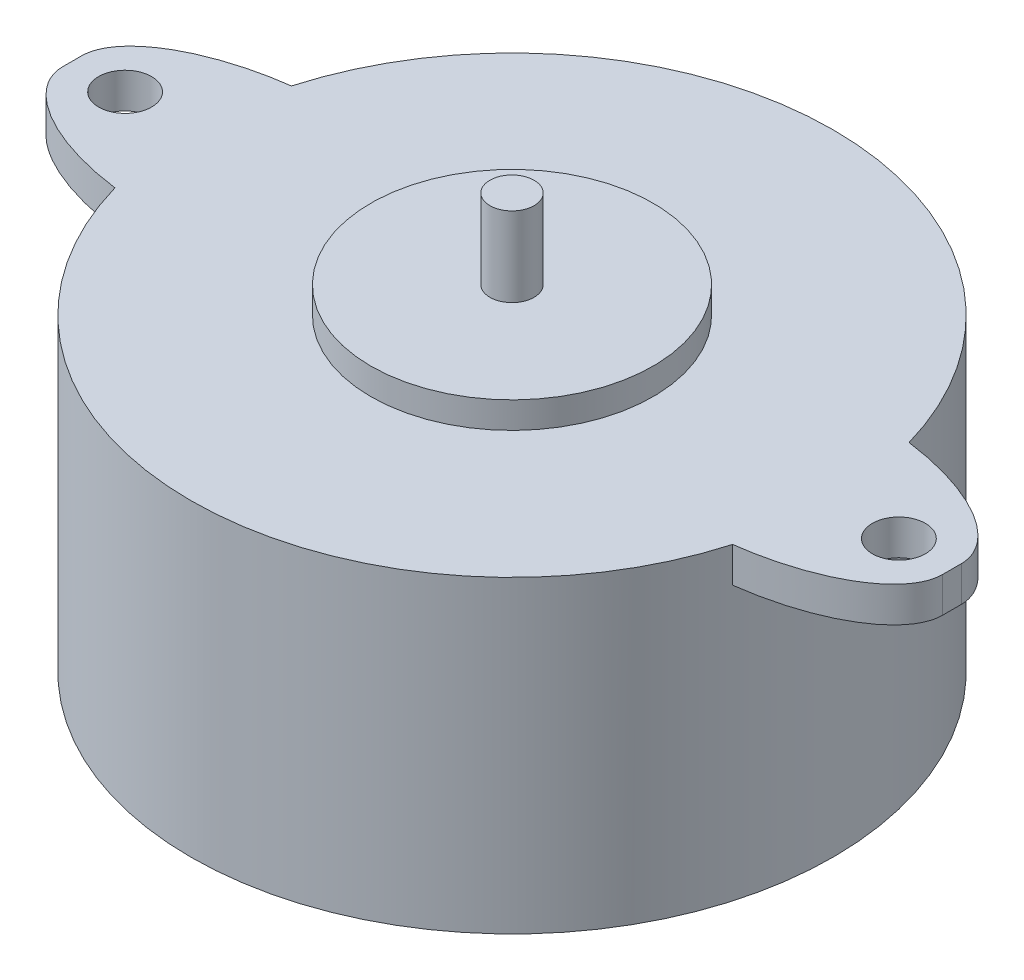
ISO-10303-21;
HEADER;
FILE_DESCRIPTION(('STEP AP214'),'2;1');
FILE_NAME('part.step','',(''),(''),'','','');
FILE_SCHEMA(('AUTOMOTIVE_DESIGN { 1 0 10303 214 1 1 1 1 }'));
ENDSEC;
DATA;
#1=APPLICATION_CONTEXT('core data for automotive mechanical design processes');
#2=APPLICATION_PROTOCOL_DEFINITION('international standard','automotive_design',2000,#1);
#3=PRODUCT_CONTEXT('',#1,'mechanical');
#4=PRODUCT('Part','Part','',(#3));
#5=PRODUCT_RELATED_PRODUCT_CATEGORY('part','',(#4));
#6=PRODUCT_DEFINITION_FORMATION('','',#4);
#7=PRODUCT_DEFINITION_CONTEXT('part definition',#1,'design');
#8=PRODUCT_DEFINITION('design','',#6,#7);
#9=PRODUCT_DEFINITION_SHAPE('','',#8);
#10=(LENGTH_UNIT() NAMED_UNIT(*) SI_UNIT(.MILLI.,.METRE.));
#11=(NAMED_UNIT(*) PLANE_ANGLE_UNIT() SI_UNIT($,.RADIAN.));
#12=(NAMED_UNIT(*) SI_UNIT($,.STERADIAN.) SOLID_ANGLE_UNIT());
#13=UNCERTAINTY_MEASURE_WITH_UNIT(LENGTH_MEASURE(1.E-05),#10,'distance_accuracy_value','');
#14=(GEOMETRIC_REPRESENTATION_CONTEXT(3) GLOBAL_UNCERTAINTY_ASSIGNED_CONTEXT((#13)) GLOBAL_UNIT_ASSIGNED_CONTEXT((#10,
#11,#12)) REPRESENTATION_CONTEXT('',''));
#15=CARTESIAN_POINT('',(0.,0.,0.));
#16=DIRECTION('',(0.,0.,1.));
#17=DIRECTION('',(1.,0.,0.));
#18=AXIS2_PLACEMENT_3D('',#15,#16,#17);
#19=CARTESIAN_POINT('',(0.,17.5,0.));
#20=DIRECTION('',(0.,-1.,0.));
#21=DIRECTION('',(0.,0.,-1.));
#22=AXIS2_PLACEMENT_3D('',#19,#20,#21);
#23=CYLINDRICAL_SURFACE('',#22,18.2);
#24=CARTESIAN_POINT('',(0.,15.5,0.));
#25=DIRECTION('',(0.,-1.,0.));
#26=DIRECTION('',(0.,0.,-1.));
#27=AXIS2_PLACEMENT_3D('',#24,#25,#26);
#28=CIRCLE('',#27,18.2);
#29=CARTESIAN_POINT('',(17.4997142833819,15.5,-5.));
#30=VERTEX_POINT('',#29);
#31=CARTESIAN_POINT('',(17.4997142833819,15.5,5.));
#32=VERTEX_POINT('',#31);
#33=EDGE_CURVE('E157',#30,#32,#28,.T.);
#34=ORIENTED_EDGE('',*,*,#33,.T.);
#35=CARTESIAN_POINT('',(17.4997142833819,17.5,4.99999999999999));
#36=CARTESIAN_POINT('',(17.4997142833819,17.4166666666667,4.99999999999999));
#37=CARTESIAN_POINT('',(17.4997142833819,17.3333333333333,4.99999999999999));
#38=CARTESIAN_POINT('',(17.4997142833819,17.1666666666667,4.99999999999999));
#39=CARTESIAN_POINT('',(17.4997142833819,17.0833333333333,4.99999999999999));
#40=CARTESIAN_POINT('',(17.4997142833819,16.9166666666667,4.99999999999999));
#41=CARTESIAN_POINT('',(17.4997142833819,16.8333333333333,4.99999999999999));
#42=CARTESIAN_POINT('',(17.4997142833819,16.6666666666667,4.99999999999999));
#43=CARTESIAN_POINT('',(17.4997142833819,16.5833333333333,4.99999999999999));
#44=CARTESIAN_POINT('',(17.4997142833819,16.4166666666667,4.99999999999999));
#45=CARTESIAN_POINT('',(17.4997142833819,16.3333333333333,4.99999999999999));
#46=CARTESIAN_POINT('',(17.4997142833819,16.1666666666667,4.99999999999999));
#47=CARTESIAN_POINT('',(17.4997142833819,16.0833333333333,4.99999999999999));
#48=CARTESIAN_POINT('',(17.4997142833819,15.9166666666667,4.99999999999999));
#49=CARTESIAN_POINT('',(17.4997142833819,15.8333333333333,4.99999999999999));
#50=CARTESIAN_POINT('',(17.4997142833819,15.6666666666667,4.99999999999999));
#51=CARTESIAN_POINT('',(17.4997142833819,15.5833333333333,4.99999999999999));
#52=CARTESIAN_POINT('',(17.4997142833819,15.5,4.99999999999999));
#53=B_SPLINE_CURVE_WITH_KNOTS('',3,(#35,#36,#37,#38,#39,#40,#41,#42,#43,#44,#45,#46,#47,#48,#49,
#50,#51,#52),.UNSPECIFIED.,.F.,.F.,(4,2,2,2,2,2,2,2,4),(0.,0.249999999999997,0.499999999999997,
0.749999999999997,1.00000000000001,1.25000000000001,1.5,1.75000000000001,2.),.UNSPECIFIED.);
#54=CARTESIAN_POINT('',(17.4997142833819,17.5,5.));
#55=VERTEX_POINT('',#54);
#56=EDGE_CURVE('E452',#32,#55,#53,.F.);
#57=ORIENTED_EDGE('',*,*,#56,.T.);
#58=CARTESIAN_POINT('',(0.,17.5,0.));
#59=DIRECTION('',(0.,1.,0.));
#60=DIRECTION('',(0.,0.,1.));
#61=AXIS2_PLACEMENT_3D('',#58,#59,#60);
#62=CIRCLE('',#61,18.2);
#63=CARTESIAN_POINT('',(-17.4997142833819,17.5,5.));
#64=VERTEX_POINT('',#63);
#65=EDGE_CURVE('E155',#64,#55,#62,.T.);
#66=ORIENTED_EDGE('',*,*,#65,.F.);
#67=CARTESIAN_POINT('',(-17.4997142833819,15.5,4.99999999999999));
#68=CARTESIAN_POINT('',(-17.4997142833819,15.5833333333333,4.99999999999999));
#69=CARTESIAN_POINT('',(-17.4997142833819,15.6666666666667,4.99999999999999));
#70=CARTESIAN_POINT('',(-17.4997142833819,15.8333333333333,4.99999999999999));
#71=CARTESIAN_POINT('',(-17.4997142833819,15.9166666666667,4.99999999999999));
#72=CARTESIAN_POINT('',(-17.4997142833819,16.0833333333333,4.99999999999999));
#73=CARTESIAN_POINT('',(-17.4997142833819,16.1666666666667,4.99999999999999));
#74=CARTESIAN_POINT('',(-17.4997142833819,16.3333333333333,4.99999999999999));
#75=CARTESIAN_POINT('',(-17.4997142833819,16.4166666666667,4.99999999999999));
#76=CARTESIAN_POINT('',(-17.4997142833819,16.5833333333333,4.99999999999999));
#77=CARTESIAN_POINT('',(-17.4997142833819,16.6666666666667,4.99999999999999));
#78=CARTESIAN_POINT('',(-17.4997142833819,16.8333333333333,4.99999999999999));
#79=CARTESIAN_POINT('',(-17.4997142833819,16.9166666666667,4.99999999999999));
#80=CARTESIAN_POINT('',(-17.4997142833819,17.0833333333333,4.99999999999999));
#81=CARTESIAN_POINT('',(-17.4997142833819,17.1666666666667,4.99999999999999));
#82=CARTESIAN_POINT('',(-17.4997142833819,17.3333333333333,4.99999999999999));
#83=CARTESIAN_POINT('',(-17.4997142833819,17.4166666666667,4.99999999999999));
#84=CARTESIAN_POINT('',(-17.4997142833819,17.5,4.99999999999999));
#85=B_SPLINE_CURVE_WITH_KNOTS('',3,(#67,#68,#69,#70,#71,#72,#73,#74,#75,#76,#77,#78,#79,#80,#81,
#82,#83,#84),.UNSPECIFIED.,.F.,.F.,(4,2,2,2,2,2,2,2,4),(0.,0.249999999999995,0.499999999999995,
0.749999999999992,0.999999999999992,1.25,1.5,1.75,2.),.UNSPECIFIED.);
#86=CARTESIAN_POINT('',(-17.4997142833819,15.5,5.));
#87=VERTEX_POINT('',#86);
#88=EDGE_CURVE('E453',#64,#87,#85,.F.);
#89=ORIENTED_EDGE('',*,*,#88,.T.);
#90=CARTESIAN_POINT('',(-17.4997142833819,15.5,-5.));
#91=VERTEX_POINT('',#90);
#92=EDGE_CURVE('E146',#87,#91,#28,.T.);
#93=ORIENTED_EDGE('',*,*,#92,.T.);
#94=CARTESIAN_POINT('',(-17.4997142833819,17.5,-4.99999999999999));
#95=CARTESIAN_POINT('',(-17.4997142833819,17.4166666666667,-4.99999999999999));
#96=CARTESIAN_POINT('',(-17.4997142833819,17.3333333333333,-4.99999999999999));
#97=CARTESIAN_POINT('',(-17.4997142833819,17.1666666666667,-4.99999999999999));
#98=CARTESIAN_POINT('',(-17.4997142833819,17.0833333333333,-4.99999999999999));
#99=CARTESIAN_POINT('',(-17.4997142833819,16.9166666666667,-4.99999999999999));
#100=CARTESIAN_POINT('',(-17.4997142833819,16.8333333333333,-4.99999999999999));
#101=CARTESIAN_POINT('',(-17.4997142833819,16.6666666666667,-4.99999999999999));
#102=CARTESIAN_POINT('',(-17.4997142833819,16.5833333333333,-4.99999999999999));
#103=CARTESIAN_POINT('',(-17.4997142833819,16.4166666666667,-4.99999999999999));
#104=CARTESIAN_POINT('',(-17.4997142833819,16.3333333333333,-4.99999999999999));
#105=CARTESIAN_POINT('',(-17.4997142833819,16.1666666666667,-4.99999999999999));
#106=CARTESIAN_POINT('',(-17.4997142833819,16.0833333333333,-4.99999999999999));
#107=CARTESIAN_POINT('',(-17.4997142833819,15.9166666666667,-4.99999999999999));
#108=CARTESIAN_POINT('',(-17.4997142833819,15.8333333333333,-4.99999999999999));
#109=CARTESIAN_POINT('',(-17.4997142833819,15.6666666666667,-4.99999999999999));
#110=CARTESIAN_POINT('',(-17.4997142833819,15.5833333333333,-4.99999999999999));
#111=CARTESIAN_POINT('',(-17.4997142833819,15.5,-4.99999999999999));
#112=B_SPLINE_CURVE_WITH_KNOTS('',3,(#94,#95,#96,#97,#98,#99,#100,#101,#102,#103,#104,#105,#106,
#107,#108,#109,#110,#111),.UNSPECIFIED.,.F.,.F.,(4,2,2,2,2,2,2,2,4),(0.,0.249999999999997,
0.499999999999997,0.749999999999997,1.00000000000001,1.25000000000001,1.5,1.75000000000001,2.),.UNSPECIFIED.);
#113=CARTESIAN_POINT('',(-17.4997142833819,17.5,-5.));
#114=VERTEX_POINT('',#113);
#115=EDGE_CURVE('E125',#91,#114,#112,.F.);
#116=ORIENTED_EDGE('',*,*,#115,.T.);
#117=CARTESIAN_POINT('',(17.4997142833819,17.5,-5.));
#118=VERTEX_POINT('',#117);
#119=EDGE_CURVE('E144',#118,#114,#62,.T.);
#120=ORIENTED_EDGE('',*,*,#119,.F.);
#121=CARTESIAN_POINT('',(17.4997142833819,15.5,-4.99999999999999));
#122=CARTESIAN_POINT('',(17.4997142833819,15.5833333333333,-4.99999999999999));
#123=CARTESIAN_POINT('',(17.4997142833819,15.6666666666667,-4.99999999999999));
#124=CARTESIAN_POINT('',(17.4997142833819,15.8333333333333,-4.99999999999999));
#125=CARTESIAN_POINT('',(17.4997142833819,15.9166666666667,-4.99999999999999));
#126=CARTESIAN_POINT('',(17.4997142833819,16.0833333333333,-4.99999999999999));
#127=CARTESIAN_POINT('',(17.4997142833819,16.1666666666667,-4.99999999999999));
#128=CARTESIAN_POINT('',(17.4997142833819,16.3333333333333,-4.99999999999999));
#129=CARTESIAN_POINT('',(17.4997142833819,16.4166666666667,-4.99999999999999));
#130=CARTESIAN_POINT('',(17.4997142833819,16.5833333333333,-4.99999999999999));
#131=CARTESIAN_POINT('',(17.4997142833819,16.6666666666667,-4.99999999999999));
#132=CARTESIAN_POINT('',(17.4997142833819,16.8333333333333,-4.99999999999999));
#133=CARTESIAN_POINT('',(17.4997142833819,16.9166666666667,-4.99999999999999));
#134=CARTESIAN_POINT('',(17.4997142833819,17.0833333333333,-4.99999999999999));
#135=CARTESIAN_POINT('',(17.4997142833819,17.1666666666667,-4.99999999999999));
#136=CARTESIAN_POINT('',(17.4997142833819,17.3333333333333,-4.99999999999999));
#137=CARTESIAN_POINT('',(17.4997142833819,17.4166666666667,-4.99999999999999));
#138=CARTESIAN_POINT('',(17.4997142833819,17.5,-4.99999999999999));
#139=B_SPLINE_CURVE_WITH_KNOTS('',3,(#121,#122,#123,#124,#125,#126,#127,#128,#129,#130,#131,
#132,#133,#134,#135,#136,#137,#138),.UNSPECIFIED.,.F.,.F.,(4,2,2,2,2,2,2,2,4),(0.,
0.249999999999995,0.499999999999995,0.749999999999992,0.999999999999992,1.25,1.5,1.75,2.),.UNSPECIFIED.);
#140=EDGE_CURVE('E147',#118,#30,#139,.F.);
#141=ORIENTED_EDGE('',*,*,#140,.T.);
#142=EDGE_LOOP('',(#34,#57,#66,#89,#93,#116,#120,#141));
#143=FACE_BOUND('',#142,.T.);
#144=CARTESIAN_POINT('',(0.,0.,0.));
#145=DIRECTION('',(0.,1.,0.));
#146=DIRECTION('',(0.,0.,1.));
#147=AXIS2_PLACEMENT_3D('',#144,#145,#146);
#148=CIRCLE('',#147,18.2);
#149=CARTESIAN_POINT('',(0.,0.,18.2));
#150=VERTEX_POINT('',#149);
#151=EDGE_CURVE('E159',#150,#150,#148,.T.);
#152=ORIENTED_EDGE('',*,*,#151,.T.);
#153=EDGE_LOOP('',(#152));
#154=FACE_BOUND('',#153,.T.);
#155=ADVANCED_FACE('F46',(#143,#154),#23,.T.);
#156=CARTESIAN_POINT('',(0.,17.5,0.));
#157=DIRECTION('',(0.,1.,0.));
#158=DIRECTION('',(0.,0.,1.));
#159=AXIS2_PLACEMENT_3D('',#156,#157,#158);
#160=PLANE('',#159);
#161=CARTESIAN_POINT('',(0.,17.5,0.));
#162=DIRECTION('',(0.,1.,0.));
#163=DIRECTION('',(0.,0.,1.));
#164=AXIS2_PLACEMENT_3D('',#161,#162,#163);
#165=CIRCLE('',#164,8.);
#166=CARTESIAN_POINT('',(0.,17.5,8.));
#167=VERTEX_POINT('',#166);
#168=EDGE_CURVE('E607',#167,#167,#165,.T.);
#169=ORIENTED_EDGE('',*,*,#168,.F.);
#170=EDGE_LOOP('',(#169));
#171=FACE_BOUND('',#170,.T.);
#172=DIRECTION('',(0.,0.,1.));
#173=VECTOR('',#172,1.);
#174=CARTESIAN_POINT('',(-24.925,17.5,-5.));
#175=LINE('',#174,#173);
#176=CARTESIAN_POINT('',(-24.925,17.5,-0.536850496288867));
#177=VERTEX_POINT('',#176);
#178=CARTESIAN_POINT('',(-24.925,17.5,0.536850496288867));
#179=VERTEX_POINT('',#178);
#180=EDGE_CURVE('E184',#177,#179,#175,.T.);
#181=ORIENTED_EDGE('',*,*,#180,.T.);
#182=CARTESIAN_POINT('',(-17.4997142833819,17.5,4.99999999999999));
#183=CARTESIAN_POINT('',(-24.925,17.5,4.04385507230183));
#184=CARTESIAN_POINT('',(-24.925,17.5,0.536850496288867));
#185=(BOUNDED_CURVE() B_SPLINE_CURVE(2,(#182,#183,#184),.UNSPECIFIED.,.F.,
.F.) B_SPLINE_CURVE_WITH_KNOTS((3,3),(0.,1.),
.UNSPECIFIED.) CURVE() GEOMETRIC_REPRESENTATION_ITEM() RATIONAL_B_SPLINE_CURVE((1.,
0.750904216660146,1.)) REPRESENTATION_ITEM(''));
#186=EDGE_CURVE('E551',#179,#64,#185,.F.);
#187=ORIENTED_EDGE('',*,*,#186,.T.);
#188=ORIENTED_EDGE('',*,*,#65,.T.);
#189=CARTESIAN_POINT('',(24.925,17.5,0.536850496288867));
#190=CARTESIAN_POINT('',(24.925,17.5,4.04385507230183));
#191=CARTESIAN_POINT('',(17.4997142833819,17.5,4.99999999999999));
#192=(BOUNDED_CURVE() B_SPLINE_CURVE(2,(#189,#190,#191),.UNSPECIFIED.,.F.,
.F.) B_SPLINE_CURVE_WITH_KNOTS((3,3),(0.,1.),
.UNSPECIFIED.) CURVE() GEOMETRIC_REPRESENTATION_ITEM() RATIONAL_B_SPLINE_CURVE((1.,
0.750904216660146,1.)) REPRESENTATION_ITEM(''));
#193=CARTESIAN_POINT('',(24.925,17.5,0.536850496288867));
#194=VERTEX_POINT('',#193);
#195=EDGE_CURVE('E196',#55,#194,#192,.F.);
#196=ORIENTED_EDGE('',*,*,#195,.T.);
#197=DIRECTION('',(0.,0.,-1.));
#198=VECTOR('',#197,1.);
#199=CARTESIAN_POINT('',(24.925,17.5,-5.));
#200=LINE('',#199,#198);
#201=CARTESIAN_POINT('',(24.925,17.5,-0.536850496288867));
#202=VERTEX_POINT('',#201);
#203=EDGE_CURVE('E193',#194,#202,#200,.T.);
#204=ORIENTED_EDGE('',*,*,#203,.T.);
#205=CARTESIAN_POINT('',(17.4997142833819,17.5,-4.99999999999999));
#206=CARTESIAN_POINT('',(24.925,17.5,-4.04385507230183));
#207=CARTESIAN_POINT('',(24.925,17.5,-0.536850496288867));
#208=(BOUNDED_CURVE() B_SPLINE_CURVE(2,(#205,#206,#207),.UNSPECIFIED.,.F.,
.F.) B_SPLINE_CURVE_WITH_KNOTS((3,3),(0.,1.),
.UNSPECIFIED.) CURVE() GEOMETRIC_REPRESENTATION_ITEM() RATIONAL_B_SPLINE_CURVE((1.,
0.750904216660146,1.)) REPRESENTATION_ITEM(''));
#209=EDGE_CURVE('E75',#202,#118,#208,.F.);
#210=ORIENTED_EDGE('',*,*,#209,.T.);
#211=ORIENTED_EDGE('',*,*,#119,.T.);
#212=CARTESIAN_POINT('',(-24.925,17.5,-0.536850496288867));
#213=CARTESIAN_POINT('',(-24.925,17.5,-4.04385507230183));
#214=CARTESIAN_POINT('',(-17.4997142833819,17.5,-4.99999999999999));
#215=(BOUNDED_CURVE() B_SPLINE_CURVE(2,(#212,#213,#214),.UNSPECIFIED.,.F.,
.F.) B_SPLINE_CURVE_WITH_KNOTS((3,3),(0.,1.),
.UNSPECIFIED.) CURVE() GEOMETRIC_REPRESENTATION_ITEM() RATIONAL_B_SPLINE_CURVE((1.,
0.750904216660146,1.)) REPRESENTATION_ITEM(''));
#216=EDGE_CURVE('E120',#114,#177,#215,.F.);
#217=ORIENTED_EDGE('',*,*,#216,.T.);
#218=EDGE_LOOP('',(#181,#187,#188,#196,#204,#210,#211,#217));
#219=FACE_BOUND('',#218,.T.);
#220=CARTESIAN_POINT('',(-21.925,17.5,0.));
#221=DIRECTION('',(0.,1.,0.));
#222=DIRECTION('',(0.,0.,1.));
#223=AXIS2_PLACEMENT_3D('',#220,#221,#222);
#224=CIRCLE('',#223,1.5);
#225=CARTESIAN_POINT('',(-21.925,17.5,1.5));
#226=VERTEX_POINT('',#225);
#227=EDGE_CURVE('E600',#226,#226,#224,.T.);
#228=ORIENTED_EDGE('',*,*,#227,.F.);
#229=EDGE_LOOP('',(#228));
#230=FACE_BOUND('',#229,.T.);
#231=CARTESIAN_POINT('',(21.925,17.5,0.));
#232=DIRECTION('',(0.,1.,0.));
#233=DIRECTION('',(0.,0.,1.));
#234=AXIS2_PLACEMENT_3D('',#231,#232,#233);
#235=CIRCLE('',#234,1.5);
#236=CARTESIAN_POINT('',(21.925,17.5,1.49999999999999));
#237=VERTEX_POINT('',#236);
#238=EDGE_CURVE('E188',#237,#237,#235,.T.);
#239=ORIENTED_EDGE('',*,*,#238,.F.);
#240=EDGE_LOOP('',(#239));
#241=FACE_BOUND('',#240,.T.);
#242=ADVANCED_FACE('F151',(#171,#219,#230,#241),#160,.T.);
#243=CARTESIAN_POINT('',(0.,0.,0.));
#244=DIRECTION('',(0.,1.,0.));
#245=DIRECTION('',(0.,0.,1.));
#246=AXIS2_PLACEMENT_3D('',#243,#244,#245);
#247=PLANE('',#246);
#248=ORIENTED_EDGE('',*,*,#151,.F.);
#249=EDGE_LOOP('',(#248));
#250=FACE_BOUND('',#249,.T.);
#251=ADVANCED_FACE('F619',(#250),#247,.F.);
#252=CARTESIAN_POINT('',(-24.925,15.5,-5.));
#253=DIRECTION('',(-1.,0.,0.));
#254=DIRECTION('',(0.,0.,1.));
#255=AXIS2_PLACEMENT_3D('',#252,#253,#254);
#256=PLANE('',#255);
#257=DIRECTION('',(0.,0.,1.));
#258=VECTOR('',#257,1.);
#259=CARTESIAN_POINT('',(-24.925,15.5,-5.));
#260=LINE('',#259,#258);
#261=CARTESIAN_POINT('',(-24.925,15.5,-0.536850496288867));
#262=VERTEX_POINT('',#261);
#263=CARTESIAN_POINT('',(-24.925,15.5,0.536850496288867));
#264=VERTEX_POINT('',#263);
#265=EDGE_CURVE('E148',#262,#264,#260,.T.);
#266=ORIENTED_EDGE('',*,*,#265,.T.);
#267=CARTESIAN_POINT('',(-24.925,17.6,0.536850496288867));
#268=CARTESIAN_POINT('',(-24.925,16.8666666666667,0.536850496288867));
#269=CARTESIAN_POINT('',(-24.925,16.1333333333333,0.536850496288867));
#270=CARTESIAN_POINT('',(-24.925,15.4,0.536850496288867));
#271=(BOUNDED_CURVE() B_SPLINE_CURVE(3,(#267,#268,#269,#270),.UNSPECIFIED.,.F.,
.F.) B_SPLINE_CURVE_WITH_KNOTS((4,4),(-9.99999999999998E-05,0.0021),
.UNSPECIFIED.) CURVE() GEOMETRIC_REPRESENTATION_ITEM() RATIONAL_B_SPLINE_CURVE((1.,1.,1.,1.)) REPRESENTATION_ITEM(''));
#272=EDGE_CURVE('E546',#264,#179,#271,.F.);
#273=ORIENTED_EDGE('',*,*,#272,.T.);
#274=ORIENTED_EDGE('',*,*,#180,.F.);
#275=CARTESIAN_POINT('',(-24.925,15.4,-0.536850496288867));
#276=CARTESIAN_POINT('',(-24.925,16.1333333333333,-0.536850496288867));
#277=CARTESIAN_POINT('',(-24.925,16.8666666666667,-0.536850496288867));
#278=CARTESIAN_POINT('',(-24.925,17.6,-0.536850496288867));
#279=(BOUNDED_CURVE() B_SPLINE_CURVE(3,(#275,#276,#277,#278),.UNSPECIFIED.,.F.,
.F.) B_SPLINE_CURVE_WITH_KNOTS((4,4),(-0.0001,0.0021),
.UNSPECIFIED.) CURVE() GEOMETRIC_REPRESENTATION_ITEM() RATIONAL_B_SPLINE_CURVE((1.,1.,1.,1.)) REPRESENTATION_ITEM(''));
#280=EDGE_CURVE('E127',#177,#262,#279,.F.);
#281=ORIENTED_EDGE('',*,*,#280,.T.);
#282=EDGE_LOOP('',(#266,#273,#274,#281));
#283=FACE_BOUND('',#282,.T.);
#284=ADVANCED_FACE('F557',(#283),#256,.T.);
#285=CARTESIAN_POINT('',(-21.925,15.5,0.));
#286=DIRECTION('',(0.,1.,0.));
#287=DIRECTION('',(0.,0.,1.));
#288=AXIS2_PLACEMENT_3D('',#285,#286,#287);
#289=CYLINDRICAL_SURFACE('',#288,1.5);
#290=CARTESIAN_POINT('',(-21.925,15.5,0.));
#291=DIRECTION('',(0.,1.,0.));
#292=DIRECTION('',(0.,0.,1.));
#293=AXIS2_PLACEMENT_3D('',#290,#291,#292);
#294=CIRCLE('',#293,1.5);
#295=CARTESIAN_POINT('',(-21.925,15.5,1.5));
#296=VERTEX_POINT('',#295);
#297=EDGE_CURVE('E598',#296,#296,#294,.T.);
#298=ORIENTED_EDGE('',*,*,#297,.F.);
#299=EDGE_LOOP('',(#298));
#300=FACE_BOUND('',#299,.T.);
#301=ORIENTED_EDGE('',*,*,#227,.T.);
#302=EDGE_LOOP('',(#301));
#303=FACE_BOUND('',#302,.T.);
#304=ADVANCED_FACE('F594',(#300,#303),#289,.F.);
#305=CARTESIAN_POINT('',(0.,15.5,0.));
#306=DIRECTION('',(0.,-1.,0.));
#307=DIRECTION('',(0.,0.,-1.));
#308=AXIS2_PLACEMENT_3D('',#305,#306,#307);
#309=PLANE('',#308);
#310=ORIENTED_EDGE('',*,*,#92,.F.);
#311=CARTESIAN_POINT('',(-24.925,15.5,0.536850496288867));
#312=CARTESIAN_POINT('',(-24.925,15.5,4.04385507230183));
#313=CARTESIAN_POINT('',(-17.4997142833819,15.5,4.99999999999999));
#314=(BOUNDED_CURVE() B_SPLINE_CURVE(2,(#311,#312,#313),.UNSPECIFIED.,.F.,
.F.) B_SPLINE_CURVE_WITH_KNOTS((3,3),(0.,1.),
.UNSPECIFIED.) CURVE() GEOMETRIC_REPRESENTATION_ITEM() RATIONAL_B_SPLINE_CURVE((1.,
0.750904216660146,1.)) REPRESENTATION_ITEM(''));
#315=EDGE_CURVE('E544',#87,#264,#314,.F.);
#316=ORIENTED_EDGE('',*,*,#315,.T.);
#317=ORIENTED_EDGE('',*,*,#265,.F.);
#318=CARTESIAN_POINT('',(-17.4997142833819,15.5,-4.99999999999999));
#319=CARTESIAN_POINT('',(-24.925,15.5,-4.04385507230183));
#320=CARTESIAN_POINT('',(-24.925,15.5,-0.536850496288867));
#321=(BOUNDED_CURVE() B_SPLINE_CURVE(2,(#318,#319,#320),.UNSPECIFIED.,.F.,
.F.) B_SPLINE_CURVE_WITH_KNOTS((3,3),(0.,1.),
.UNSPECIFIED.) CURVE() GEOMETRIC_REPRESENTATION_ITEM() RATIONAL_B_SPLINE_CURVE((1.,
0.750904216660146,1.)) REPRESENTATION_ITEM(''));
#322=EDGE_CURVE('E553',#262,#91,#321,.F.);
#323=ORIENTED_EDGE('',*,*,#322,.T.);
#324=EDGE_LOOP('',(#310,#316,#317,#323));
#325=FACE_BOUND('',#324,.T.);
#326=ORIENTED_EDGE('',*,*,#297,.T.);
#327=EDGE_LOOP('',(#326));
#328=FACE_BOUND('',#327,.T.);
#329=ADVANCED_FACE('F559',(#325,#328),#309,.T.);
#330=ORIENTED_EDGE('',*,*,#33,.F.);
#331=CARTESIAN_POINT('',(24.925,15.5,-0.536850496288867));
#332=CARTESIAN_POINT('',(24.925,15.5,-4.04385507230183));
#333=CARTESIAN_POINT('',(17.4997142833819,15.5,-4.99999999999999));
#334=(BOUNDED_CURVE() B_SPLINE_CURVE(2,(#331,#332,#333),.UNSPECIFIED.,.F.,
.F.) B_SPLINE_CURVE_WITH_KNOTS((3,3),(0.,1.),
.UNSPECIFIED.) CURVE() GEOMETRIC_REPRESENTATION_ITEM() RATIONAL_B_SPLINE_CURVE((1.,
0.750904216660146,1.)) REPRESENTATION_ITEM(''));
#335=CARTESIAN_POINT('',(24.925,15.5,-0.536850496288867));
#336=VERTEX_POINT('',#335);
#337=EDGE_CURVE('E13',#30,#336,#334,.F.);
#338=ORIENTED_EDGE('',*,*,#337,.T.);
#339=DIRECTION('',(0.,0.,-1.));
#340=VECTOR('',#339,1.);
#341=CARTESIAN_POINT('',(24.925,15.5,-5.));
#342=LINE('',#341,#340);
#343=CARTESIAN_POINT('',(24.925,15.5,0.536850496288867));
#344=VERTEX_POINT('',#343);
#345=EDGE_CURVE('E181',#344,#336,#342,.T.);
#346=ORIENTED_EDGE('',*,*,#345,.F.);
#347=CARTESIAN_POINT('',(17.4997142833819,15.5,4.99999999999999));
#348=CARTESIAN_POINT('',(24.925,15.5,4.04385507230183));
#349=CARTESIAN_POINT('',(24.925,15.5,0.536850496288867));
#350=(BOUNDED_CURVE() B_SPLINE_CURVE(2,(#347,#348,#349),.UNSPECIFIED.,.F.,
.F.) B_SPLINE_CURVE_WITH_KNOTS((3,3),(0.,1.),
.UNSPECIFIED.) CURVE() GEOMETRIC_REPRESENTATION_ITEM() RATIONAL_B_SPLINE_CURVE((1.,
0.750904216660146,1.)) REPRESENTATION_ITEM(''));
#351=EDGE_CURVE('E134',#344,#32,#350,.F.);
#352=ORIENTED_EDGE('',*,*,#351,.T.);
#353=EDGE_LOOP('',(#330,#338,#346,#352));
#354=FACE_BOUND('',#353,.T.);
#355=CARTESIAN_POINT('',(21.925,15.5,0.));
#356=DIRECTION('',(0.,1.,0.));
#357=DIRECTION('',(0.,0.,1.));
#358=AXIS2_PLACEMENT_3D('',#355,#356,#357);
#359=CIRCLE('',#358,1.5);
#360=CARTESIAN_POINT('',(21.925,15.5,1.49999999999999));
#361=VERTEX_POINT('',#360);
#362=EDGE_CURVE('E194',#361,#361,#359,.T.);
#363=ORIENTED_EDGE('',*,*,#362,.T.);
#364=EDGE_LOOP('',(#363));
#365=FACE_BOUND('',#364,.T.);
#366=ADVANCED_FACE('F593',(#354,#365),#309,.T.);
#367=CARTESIAN_POINT('',(24.925,15.5,-5.));
#368=DIRECTION('',(1.,0.,0.));
#369=DIRECTION('',(0.,0.,-1.));
#370=AXIS2_PLACEMENT_3D('',#367,#368,#369);
#371=PLANE('',#370);
#372=ORIENTED_EDGE('',*,*,#345,.T.);
#373=CARTESIAN_POINT('',(24.925,17.6,-0.536850496288867));
#374=CARTESIAN_POINT('',(24.925,16.8666666666667,-0.536850496288867));
#375=CARTESIAN_POINT('',(24.925,16.1333333333333,-0.536850496288867));
#376=CARTESIAN_POINT('',(24.925,15.4,-0.536850496288867));
#377=(BOUNDED_CURVE() B_SPLINE_CURVE(3,(#373,#374,#375,#376),.UNSPECIFIED.,.F.,
.F.) B_SPLINE_CURVE_WITH_KNOTS((4,4),(-9.99999999999998E-05,0.0021),
.UNSPECIFIED.) CURVE() GEOMETRIC_REPRESENTATION_ITEM() RATIONAL_B_SPLINE_CURVE((1.,1.,1.,1.)) REPRESENTATION_ITEM(''));
#378=EDGE_CURVE('E61',#336,#202,#377,.F.);
#379=ORIENTED_EDGE('',*,*,#378,.T.);
#380=ORIENTED_EDGE('',*,*,#203,.F.);
#381=CARTESIAN_POINT('',(24.925,15.4,0.536850496288867));
#382=CARTESIAN_POINT('',(24.925,16.1333333333333,0.536850496288867));
#383=CARTESIAN_POINT('',(24.925,16.8666666666667,0.536850496288867));
#384=CARTESIAN_POINT('',(24.925,17.6,0.536850496288867));
#385=(BOUNDED_CURVE() B_SPLINE_CURVE(3,(#381,#382,#383,#384),.UNSPECIFIED.,.F.,
.F.) B_SPLINE_CURVE_WITH_KNOTS((4,4),(-0.0001,0.0021),
.UNSPECIFIED.) CURVE() GEOMETRIC_REPRESENTATION_ITEM() RATIONAL_B_SPLINE_CURVE((1.,1.,1.,1.)) REPRESENTATION_ITEM(''));
#386=EDGE_CURVE('E204',#194,#344,#385,.F.);
#387=ORIENTED_EDGE('',*,*,#386,.T.);
#388=EDGE_LOOP('',(#372,#379,#380,#387));
#389=FACE_BOUND('',#388,.T.);
#390=ADVANCED_FACE('F206',(#389),#371,.T.);
#391=CARTESIAN_POINT('',(21.925,15.5,0.));
#392=DIRECTION('',(0.,1.,0.));
#393=DIRECTION('',(0.,0.,1.));
#394=AXIS2_PLACEMENT_3D('',#391,#392,#393);
#395=CYLINDRICAL_SURFACE('',#394,1.5);
#396=ORIENTED_EDGE('',*,*,#362,.F.);
#397=EDGE_LOOP('',(#396));
#398=FACE_BOUND('',#397,.T.);
#399=ORIENTED_EDGE('',*,*,#238,.T.);
#400=EDGE_LOOP('',(#399));
#401=FACE_BOUND('',#400,.T.);
#402=ADVANCED_FACE('F235',(#398,#401),#395,.F.);
#403=CARTESIAN_POINT('',(17.4997142833819,15.4,4.99999999999999));
#404=CARTESIAN_POINT('',(17.4997142833819,16.1333333333333,4.99999999999999));
#405=CARTESIAN_POINT('',(17.4997142833819,16.8666666666667,4.99999999999999));
#406=CARTESIAN_POINT('',(17.4997142833819,17.6,4.99999999999999));
#407=CARTESIAN_POINT('',(24.925,15.4,4.04385507230183));
#408=CARTESIAN_POINT('',(24.925,16.1333333333333,4.04385507230183));
#409=CARTESIAN_POINT('',(24.925,16.8666666666667,4.04385507230183));
#410=CARTESIAN_POINT('',(24.925,17.6,4.04385507230183));
#411=CARTESIAN_POINT('',(24.925,15.4,0.536850496288867));
#412=CARTESIAN_POINT('',(24.925,16.1333333333333,0.536850496288867));
#413=CARTESIAN_POINT('',(24.925,16.8666666666667,0.536850496288867));
#414=CARTESIAN_POINT('',(24.925,17.6,0.536850496288867));
#415=(BOUNDED_SURFACE() B_SPLINE_SURFACE(2,3,((#403,#404,#405,#406),(#407,#408,#409,#410),(#411,
#412,#413,#414)),.UNSPECIFIED.,.F.,.F.,.F.) B_SPLINE_SURFACE_WITH_KNOTS((3,3),(4,4),(0.,1.),
(-0.0001,0.0021),.UNSPECIFIED.) GEOMETRIC_REPRESENTATION_ITEM() RATIONAL_B_SPLINE_SURFACE(((1.,
1.,1.,1.),(0.750904216660146,0.750904216660146,0.750904216660146,0.750904216660146),(1.,1.,1.,1.))) REPRESENTATION_ITEM('') SURFACE());
#416=ORIENTED_EDGE('',*,*,#351,.F.);
#417=ORIENTED_EDGE('',*,*,#386,.F.);
#418=ORIENTED_EDGE('',*,*,#195,.F.);
#419=ORIENTED_EDGE('',*,*,#56,.F.);
#420=EDGE_LOOP('',(#416,#417,#418,#419));
#421=FACE_BOUND('',#420,.T.);
#422=ADVANCED_FACE('F210',(#421),#415,.T.);
#423=CARTESIAN_POINT('',(-17.4997142833819,15.4,-4.99999999999999));
#424=CARTESIAN_POINT('',(-17.4997142833819,16.1333333333333,-4.99999999999999));
#425=CARTESIAN_POINT('',(-17.4997142833819,16.8666666666667,-4.99999999999999));
#426=CARTESIAN_POINT('',(-17.4997142833819,17.6,-4.99999999999999));
#427=CARTESIAN_POINT('',(-24.925,15.4,-4.04385507230183));
#428=CARTESIAN_POINT('',(-24.925,16.1333333333333,-4.04385507230183));
#429=CARTESIAN_POINT('',(-24.925,16.8666666666667,-4.04385507230183));
#430=CARTESIAN_POINT('',(-24.925,17.6,-4.04385507230183));
#431=CARTESIAN_POINT('',(-24.925,15.4,-0.536850496288867));
#432=CARTESIAN_POINT('',(-24.925,16.1333333333333,-0.536850496288867));
#433=CARTESIAN_POINT('',(-24.925,16.8666666666667,-0.536850496288867));
#434=CARTESIAN_POINT('',(-24.925,17.6,-0.536850496288867));
#435=(BOUNDED_SURFACE() B_SPLINE_SURFACE(2,3,((#423,#424,#425,#426),(#427,#428,#429,#430),(#431,
#432,#433,#434)),.UNSPECIFIED.,.F.,.F.,.F.) B_SPLINE_SURFACE_WITH_KNOTS((3,3),(4,4),(0.,1.),
(-0.0001,0.0021),.UNSPECIFIED.) GEOMETRIC_REPRESENTATION_ITEM() RATIONAL_B_SPLINE_SURFACE(((1.,
1.,1.,1.),(0.750904216660146,0.750904216660146,0.750904216660146,0.750904216660146),(1.,1.,1.,1.))) REPRESENTATION_ITEM('') SURFACE());
#436=ORIENTED_EDGE('',*,*,#322,.F.);
#437=ORIENTED_EDGE('',*,*,#280,.F.);
#438=ORIENTED_EDGE('',*,*,#216,.F.);
#439=ORIENTED_EDGE('',*,*,#115,.F.);
#440=EDGE_LOOP('',(#436,#437,#438,#439));
#441=FACE_BOUND('',#440,.T.);
#442=ADVANCED_FACE('F124',(#441),#435,.T.);
#443=CARTESIAN_POINT('',(-24.925,15.4,0.536850496288867));
#444=CARTESIAN_POINT('',(-24.925,16.1333333333333,0.536850496288867));
#445=CARTESIAN_POINT('',(-24.925,16.8666666666667,0.536850496288867));
#446=CARTESIAN_POINT('',(-24.925,17.6,0.536850496288867));
#447=CARTESIAN_POINT('',(-24.925,15.4,4.04385507230183));
#448=CARTESIAN_POINT('',(-24.925,16.1333333333333,4.04385507230183));
#449=CARTESIAN_POINT('',(-24.925,16.8666666666667,4.04385507230183));
#450=CARTESIAN_POINT('',(-24.925,17.6,4.04385507230183));
#451=CARTESIAN_POINT('',(-17.4997142833819,15.4,4.99999999999999));
#452=CARTESIAN_POINT('',(-17.4997142833819,16.1333333333333,4.99999999999999));
#453=CARTESIAN_POINT('',(-17.4997142833819,16.8666666666667,4.99999999999999));
#454=CARTESIAN_POINT('',(-17.4997142833819,17.6,4.99999999999999));
#455=(BOUNDED_SURFACE() B_SPLINE_SURFACE(2,3,((#443,#444,#445,#446),(#447,#448,#449,#450),(#451,
#452,#453,#454)),.UNSPECIFIED.,.F.,.F.,.F.) B_SPLINE_SURFACE_WITH_KNOTS((3,3),(4,4),(0.,1.),
(-0.0001,0.0021),.UNSPECIFIED.) GEOMETRIC_REPRESENTATION_ITEM() RATIONAL_B_SPLINE_SURFACE(((1.,
1.,1.,1.),(0.750904216660146,0.750904216660146,0.750904216660146,0.750904216660146),(1.,1.,1.,1.))) REPRESENTATION_ITEM('') SURFACE());
#456=ORIENTED_EDGE('',*,*,#315,.F.);
#457=ORIENTED_EDGE('',*,*,#88,.F.);
#458=ORIENTED_EDGE('',*,*,#186,.F.);
#459=ORIENTED_EDGE('',*,*,#272,.F.);
#460=EDGE_LOOP('',(#456,#457,#458,#459));
#461=FACE_BOUND('',#460,.T.);
#462=ADVANCED_FACE('F506',(#461),#455,.T.);
#463=CARTESIAN_POINT('',(24.925,15.4,-0.536850496288867));
#464=CARTESIAN_POINT('',(24.925,16.1333333333333,-0.536850496288867));
#465=CARTESIAN_POINT('',(24.925,16.8666666666667,-0.536850496288867));
#466=CARTESIAN_POINT('',(24.925,17.6,-0.536850496288867));
#467=CARTESIAN_POINT('',(24.925,15.4,-4.04385507230183));
#468=CARTESIAN_POINT('',(24.925,16.1333333333333,-4.04385507230183));
#469=CARTESIAN_POINT('',(24.925,16.8666666666667,-4.04385507230183));
#470=CARTESIAN_POINT('',(24.925,17.6,-4.04385507230183));
#471=CARTESIAN_POINT('',(17.4997142833819,15.4,-4.99999999999999));
#472=CARTESIAN_POINT('',(17.4997142833819,16.1333333333333,-4.99999999999999));
#473=CARTESIAN_POINT('',(17.4997142833819,16.8666666666667,-4.99999999999999));
#474=CARTESIAN_POINT('',(17.4997142833819,17.6,-4.99999999999999));
#475=(BOUNDED_SURFACE() B_SPLINE_SURFACE(2,3,((#463,#464,#465,#466),(#467,#468,#469,#470),(#471,
#472,#473,#474)),.UNSPECIFIED.,.F.,.F.,.F.) B_SPLINE_SURFACE_WITH_KNOTS((3,3),(4,4),(0.,1.),
(-0.0001,0.0021),.UNSPECIFIED.) GEOMETRIC_REPRESENTATION_ITEM() RATIONAL_B_SPLINE_SURFACE(((1.,
1.,1.,1.),(0.750904216660146,0.750904216660146,0.750904216660146,0.750904216660146),(1.,1.,1.,1.))) REPRESENTATION_ITEM('') SURFACE());
#476=ORIENTED_EDGE('',*,*,#337,.F.);
#477=ORIENTED_EDGE('',*,*,#140,.F.);
#478=ORIENTED_EDGE('',*,*,#209,.F.);
#479=ORIENTED_EDGE('',*,*,#378,.F.);
#480=EDGE_LOOP('',(#476,#477,#478,#479));
#481=FACE_BOUND('',#480,.T.);
#482=ADVANCED_FACE('F49',(#481),#475,.T.);
#483=CARTESIAN_POINT('',(0.,19.,0.));
#484=DIRECTION('',(0.,-1.,0.));
#485=DIRECTION('',(0.,0.,-1.));
#486=AXIS2_PLACEMENT_3D('',#483,#484,#485);
#487=CYLINDRICAL_SURFACE('',#486,8.);
#488=CARTESIAN_POINT('',(0.,19.,0.));
#489=DIRECTION('',(0.,1.,0.));
#490=DIRECTION('',(0.,0.,1.));
#491=AXIS2_PLACEMENT_3D('',#488,#489,#490);
#492=CIRCLE('',#491,8.);
#493=CARTESIAN_POINT('',(0.,19.,8.));
#494=VERTEX_POINT('',#493);
#495=EDGE_CURVE('E604',#494,#494,#492,.T.);
#496=ORIENTED_EDGE('',*,*,#495,.F.);
#497=EDGE_LOOP('',(#496));
#498=FACE_BOUND('',#497,.T.);
#499=ORIENTED_EDGE('',*,*,#168,.T.);
#500=EDGE_LOOP('',(#499));
#501=FACE_BOUND('',#500,.T.);
#502=ADVANCED_FACE('F744',(#498,#501),#487,.T.);
#503=CARTESIAN_POINT('',(0.,19.,0.));
#504=DIRECTION('',(0.,1.,0.));
#505=DIRECTION('',(0.,0.,1.));
#506=AXIS2_PLACEMENT_3D('',#503,#504,#505);
#507=PLANE('',#506);
#508=CARTESIAN_POINT('',(0.,19.,0.));
#509=DIRECTION('',(0.,1.,0.));
#510=DIRECTION('',(0.,0.,1.));
#511=AXIS2_PLACEMENT_3D('',#508,#509,#510);
#512=CIRCLE('',#511,1.25);
#513=CARTESIAN_POINT('',(0.,19.,1.25));
#514=VERTEX_POINT('',#513);
#515=EDGE_CURVE('E843',#514,#514,#512,.T.);
#516=ORIENTED_EDGE('',*,*,#515,.F.);
#517=EDGE_LOOP('',(#516));
#518=FACE_BOUND('',#517,.T.);
#519=ORIENTED_EDGE('',*,*,#495,.T.);
#520=EDGE_LOOP('',(#519));
#521=FACE_BOUND('',#520,.T.);
#522=ADVANCED_FACE('F750',(#518,#521),#507,.T.);
#523=CARTESIAN_POINT('',(0.,23.5,0.));
#524=DIRECTION('',(0.,-1.,0.));
#525=DIRECTION('',(0.,0.,-1.));
#526=AXIS2_PLACEMENT_3D('',#523,#524,#525);
#527=CYLINDRICAL_SURFACE('',#526,1.25);
#528=CARTESIAN_POINT('',(0.,23.5,0.));
#529=DIRECTION('',(0.,1.,0.));
#530=DIRECTION('',(0.,0.,1.));
#531=AXIS2_PLACEMENT_3D('',#528,#529,#530);
#532=CIRCLE('',#531,1.25);
#533=CARTESIAN_POINT('',(0.,23.5,1.25));
#534=VERTEX_POINT('',#533);
#535=EDGE_CURVE('E842',#534,#534,#532,.T.);
#536=ORIENTED_EDGE('',*,*,#535,.F.);
#537=EDGE_LOOP('',(#536));
#538=FACE_BOUND('',#537,.T.);
#539=ORIENTED_EDGE('',*,*,#515,.T.);
#540=EDGE_LOOP('',(#539));
#541=FACE_BOUND('',#540,.T.);
#542=ADVANCED_FACE('F758',(#538,#541),#527,.T.);
#543=CARTESIAN_POINT('',(0.,23.5,0.));
#544=DIRECTION('',(0.,1.,0.));
#545=DIRECTION('',(0.,0.,1.));
#546=AXIS2_PLACEMENT_3D('',#543,#544,#545);
#547=PLANE('',#546);
#548=ORIENTED_EDGE('',*,*,#535,.T.);
#549=EDGE_LOOP('',(#548));
#550=FACE_BOUND('',#549,.T.);
#551=ADVANCED_FACE('F766',(#550),#547,.T.);
#552=CLOSED_SHELL('',(#155,#242,#251,#284,#304,#329,#366,#390,#402,#422,#442,#462,#482,#502,
#522,#542,#551));
#553=MANIFOLD_SOLID_BREP('B2',#552);
#554=ADVANCED_BREP_SHAPE_REPRESENTATION('',(#18,#553),#14);
#555=SHAPE_DEFINITION_REPRESENTATION(#9,#554);
ENDSEC;
END-ISO-10303-21;
